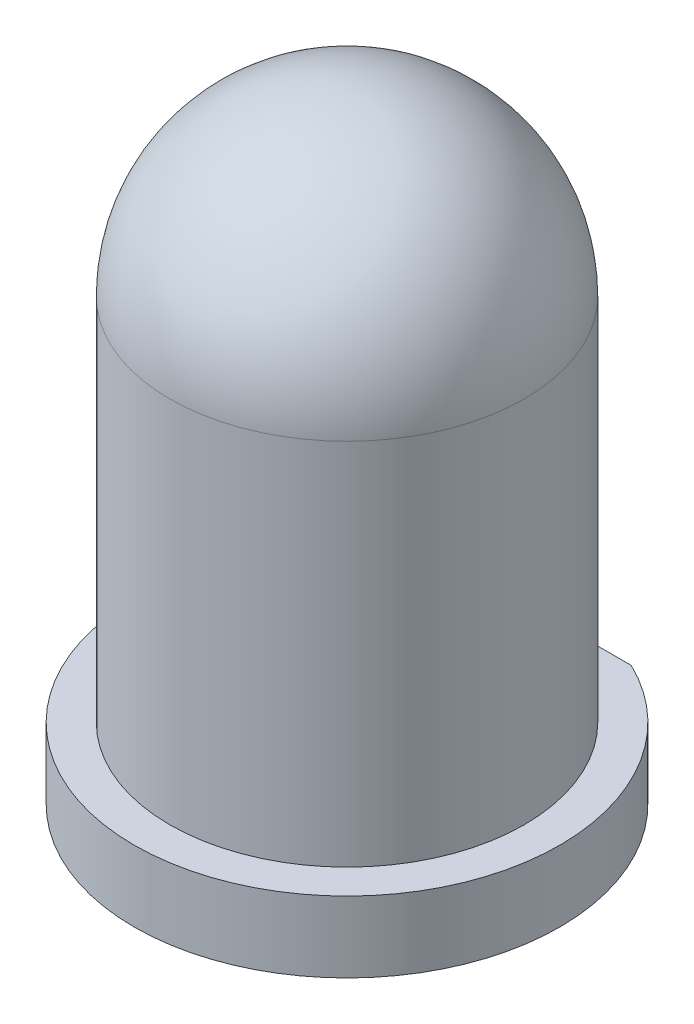
ISO-10303-21;
HEADER;
FILE_DESCRIPTION(('STEP AP214'),'2;1');
FILE_NAME('part.step','',(''),(''),'','','');
FILE_SCHEMA(('AUTOMOTIVE_DESIGN { 1 0 10303 214 1 1 1 1 }'));
ENDSEC;
DATA;
#1=APPLICATION_CONTEXT('core data for automotive mechanical design processes');
#2=APPLICATION_PROTOCOL_DEFINITION('international standard','automotive_design',2000,#1);
#3=PRODUCT_CONTEXT('',#1,'mechanical');
#4=PRODUCT('Part','Part','',(#3));
#5=PRODUCT_RELATED_PRODUCT_CATEGORY('part','',(#4));
#6=PRODUCT_DEFINITION_FORMATION('','',#4);
#7=PRODUCT_DEFINITION_CONTEXT('part definition',#1,'design');
#8=PRODUCT_DEFINITION('design','',#6,#7);
#9=PRODUCT_DEFINITION_SHAPE('','',#8);
#10=(LENGTH_UNIT() NAMED_UNIT(*) SI_UNIT(.MILLI.,.METRE.));
#11=(NAMED_UNIT(*) PLANE_ANGLE_UNIT() SI_UNIT($,.RADIAN.));
#12=(NAMED_UNIT(*) SI_UNIT($,.STERADIAN.) SOLID_ANGLE_UNIT());
#13=UNCERTAINTY_MEASURE_WITH_UNIT(LENGTH_MEASURE(1.E-05),#10,'distance_accuracy_value','');
#14=(GEOMETRIC_REPRESENTATION_CONTEXT(3) GLOBAL_UNCERTAINTY_ASSIGNED_CONTEXT((#13)) GLOBAL_UNIT_ASSIGNED_CONTEXT((#10,
#11,#12)) REPRESENTATION_CONTEXT('',''));
#15=CARTESIAN_POINT('',(0.,0.,0.));
#16=DIRECTION('',(0.,0.,1.));
#17=DIRECTION('',(1.,0.,0.));
#18=AXIS2_PLACEMENT_3D('',#15,#16,#17);
#19=CARTESIAN_POINT('',(0.,-0.5,0.));
#20=DIRECTION('',(0.,1.,0.));
#21=DIRECTION('',(0.,0.,1.));
#22=AXIS2_PLACEMENT_3D('',#19,#20,#21);
#23=PLANE('',#22);
#24=CARTESIAN_POINT('',(0.,-0.5,0.));
#25=DIRECTION('',(0.,-1.,0.));
#26=DIRECTION('',(0.,0.,-1.));
#27=AXIS2_PLACEMENT_3D('',#24,#25,#26);
#28=CIRCLE('',#27,3.);
#29=CARTESIAN_POINT('',(1.3076696830622,-0.5,-2.7));
#30=VERTEX_POINT('',#29);
#31=CARTESIAN_POINT('',(-1.3076696830622,-0.5,-2.7));
#32=VERTEX_POINT('',#31);
#33=EDGE_CURVE('E78',#30,#32,#28,.T.);
#34=ORIENTED_EDGE('',*,*,#33,.T.);
#35=DIRECTION('',(1.,0.,0.));
#36=VECTOR('',#35,1.);
#37=CARTESIAN_POINT('',(-7.,-0.5,-2.7));
#38=LINE('',#37,#36);
#39=EDGE_CURVE('E63',#32,#30,#38,.T.);
#40=ORIENTED_EDGE('',*,*,#39,.T.);
#41=EDGE_LOOP('',(#34,#40));
#42=FACE_BOUND('',#41,.T.);
#43=ADVANCED_FACE('F39',(#42),#23,.F.);
#44=CARTESIAN_POINT('',(0.,5.7,0.));
#45=DIRECTION('',(0.,-1.,0.));
#46=DIRECTION('',(-1.,0.,0.));
#47=AXIS2_PLACEMENT_3D('',#44,#45,#46);
#48=SPHERICAL_SURFACE('',#47,2.5);
#49=CARTESIAN_POINT('',(0.,5.7,0.));
#50=DIRECTION('',(0.,-1.,0.));
#51=DIRECTION('',(0.,0.,-1.));
#52=AXIS2_PLACEMENT_3D('',#49,#50,#51);
#53=CIRCLE('',#52,2.5);
#54=CARTESIAN_POINT('',(0.,5.7,-2.5));
#55=VERTEX_POINT('',#54);
#56=EDGE_CURVE('E83',#55,#55,#53,.T.);
#57=ORIENTED_EDGE('',*,*,#56,.F.);
#58=EDGE_LOOP('',(#57));
#59=FACE_BOUND('',#58,.T.);
#60=ADVANCED_FACE('F95',(#59),#48,.T.);
#61=CARTESIAN_POINT('',(0.,-0.5,0.));
#62=DIRECTION('',(0.,-1.,0.));
#63=DIRECTION('',(0.,0.,-1.));
#64=AXIS2_PLACEMENT_3D('',#61,#62,#63);
#65=CYLINDRICAL_SURFACE('',#64,2.5);
#66=ORIENTED_EDGE('',*,*,#56,.T.);
#67=EDGE_LOOP('',(#66));
#68=FACE_BOUND('',#67,.T.);
#69=CARTESIAN_POINT('',(0.,0.5,0.));
#70=DIRECTION('',(0.,-1.,0.));
#71=DIRECTION('',(0.,0.,-1.));
#72=AXIS2_PLACEMENT_3D('',#69,#70,#71);
#73=CIRCLE('',#72,2.5);
#74=CARTESIAN_POINT('',(0.,0.5,-2.5));
#75=VERTEX_POINT('',#74);
#76=EDGE_CURVE('E77',#75,#75,#73,.T.);
#77=ORIENTED_EDGE('',*,*,#76,.F.);
#78=EDGE_LOOP('',(#77));
#79=FACE_BOUND('',#78,.T.);
#80=ADVANCED_FACE('F92',(#68,#79),#65,.T.);
#81=CARTESIAN_POINT('',(0.,0.5,0.));
#82=DIRECTION('',(0.,1.,0.));
#83=DIRECTION('',(0.,0.,1.));
#84=AXIS2_PLACEMENT_3D('',#81,#82,#83);
#85=PLANE('',#84);
#86=DIRECTION('',(1.,0.,0.));
#87=VECTOR('',#86,1.);
#88=CARTESIAN_POINT('',(-7.,0.5,-2.7));
#89=LINE('',#88,#87);
#90=CARTESIAN_POINT('',(-1.3076696830622,0.5,-2.7));
#91=VERTEX_POINT('',#90);
#92=CARTESIAN_POINT('',(1.3076696830622,0.5,-2.7));
#93=VERTEX_POINT('',#92);
#94=EDGE_CURVE('E54',#91,#93,#89,.T.);
#95=ORIENTED_EDGE('',*,*,#94,.F.);
#96=CARTESIAN_POINT('',(0.,0.5,0.));
#97=DIRECTION('',(0.,-1.,0.));
#98=DIRECTION('',(0.,0.,-1.));
#99=AXIS2_PLACEMENT_3D('',#96,#97,#98);
#100=CIRCLE('',#99,3.);
#101=EDGE_CURVE('E72',#93,#91,#100,.T.);
#102=ORIENTED_EDGE('',*,*,#101,.F.);
#103=EDGE_LOOP('',(#95,#102));
#104=FACE_BOUND('',#103,.T.);
#105=ORIENTED_EDGE('',*,*,#76,.T.);
#106=EDGE_LOOP('',(#105));
#107=FACE_BOUND('',#106,.T.);
#108=ADVANCED_FACE('F70',(#104,#107),#85,.T.);
#109=CARTESIAN_POINT('',(0.,-0.5,0.));
#110=DIRECTION('',(0.,-1.,0.));
#111=DIRECTION('',(0.,0.,-1.));
#112=AXIS2_PLACEMENT_3D('',#109,#110,#111);
#113=CYLINDRICAL_SURFACE('',#112,3.);
#114=ORIENTED_EDGE('',*,*,#101,.T.);
#115=DIRECTION('',(0.,-1.,0.));
#116=VECTOR('',#115,1.);
#117=CARTESIAN_POINT('',(-1.3076696830622,-0.5,-2.7));
#118=LINE('',#117,#116);
#119=EDGE_CURVE('E11',#91,#32,#118,.T.);
#120=ORIENTED_EDGE('',*,*,#119,.T.);
#121=ORIENTED_EDGE('',*,*,#33,.F.);
#122=DIRECTION('',(0.,-1.,0.));
#123=VECTOR('',#122,1.);
#124=CARTESIAN_POINT('',(1.3076696830622,-0.5,-2.7));
#125=LINE('',#124,#123);
#126=EDGE_CURVE('E47',#30,#93,#125,.F.);
#127=ORIENTED_EDGE('',*,*,#126,.T.);
#128=EDGE_LOOP('',(#114,#120,#121,#127));
#129=FACE_BOUND('',#128,.T.);
#130=ADVANCED_FACE('F75',(#129),#113,.T.);
#131=CARTESIAN_POINT('',(-7.,0.5,-2.7));
#132=DIRECTION('',(0.,0.,1.));
#133=DIRECTION('',(1.,0.,0.));
#134=AXIS2_PLACEMENT_3D('',#131,#132,#133);
#135=PLANE('',#134);
#136=ORIENTED_EDGE('',*,*,#94,.T.);
#137=ORIENTED_EDGE('',*,*,#126,.F.);
#138=ORIENTED_EDGE('',*,*,#39,.F.);
#139=ORIENTED_EDGE('',*,*,#119,.F.);
#140=EDGE_LOOP('',(#136,#137,#138,#139));
#141=FACE_BOUND('',#140,.T.);
#142=ADVANCED_FACE('F62',(#141),#135,.F.);
#143=CLOSED_SHELL('',(#43,#60,#80,#108,#130,#142));
#144=MANIFOLD_SOLID_BREP('B2',#143);
#145=ADVANCED_BREP_SHAPE_REPRESENTATION('',(#18,#144),#14);
#146=SHAPE_DEFINITION_REPRESENTATION(#9,#145);
ENDSEC;
END-ISO-10303-21;
